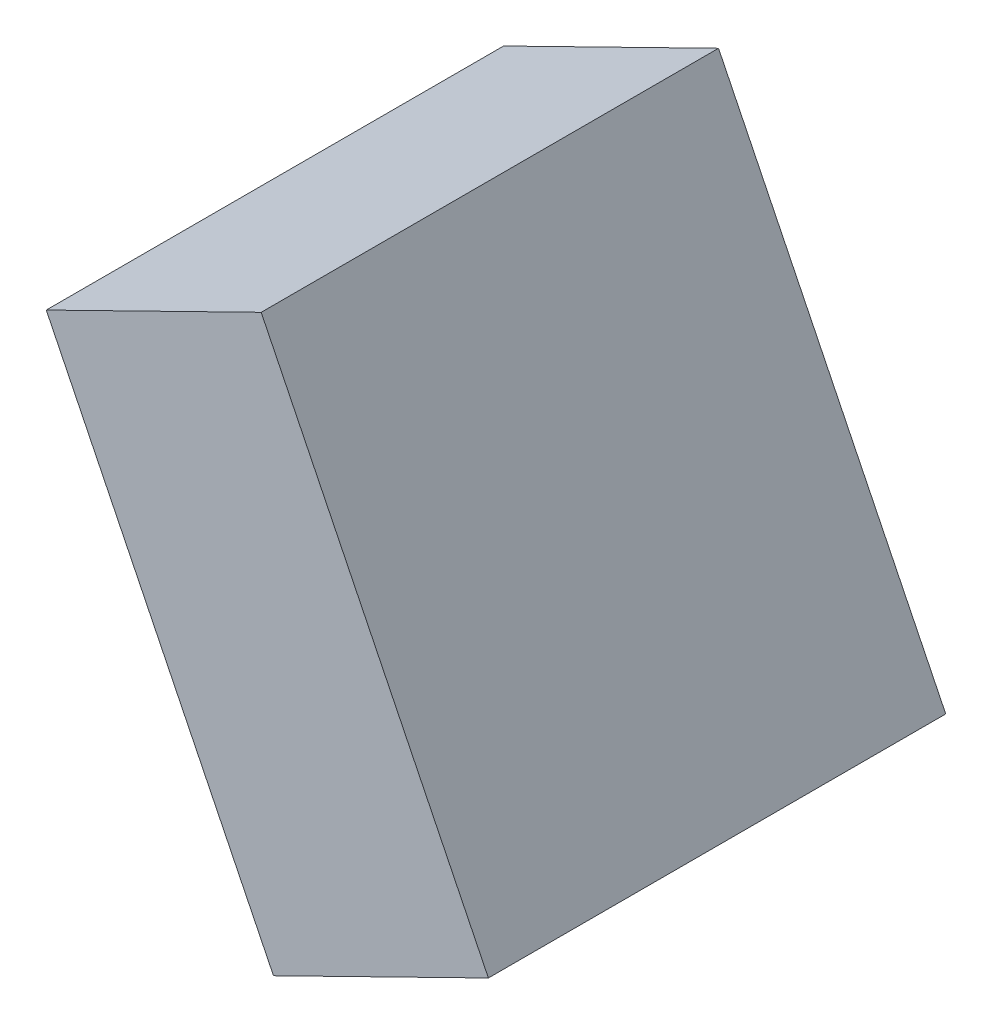
ISO-10303-21;
HEADER;
FILE_DESCRIPTION(('STEP AP214'),'2;1');
FILE_NAME('part.step','',(''),(''),'','','');
FILE_SCHEMA(('AUTOMOTIVE_DESIGN { 1 0 10303 214 1 1 1 1 }'));
ENDSEC;
DATA;
#1=APPLICATION_CONTEXT('core data for automotive mechanical design processes');
#2=APPLICATION_PROTOCOL_DEFINITION('international standard','automotive_design',2000,#1);
#3=PRODUCT_CONTEXT('',#1,'mechanical');
#4=PRODUCT('Part','Part','',(#3));
#5=PRODUCT_RELATED_PRODUCT_CATEGORY('part','',(#4));
#6=PRODUCT_DEFINITION_FORMATION('','',#4);
#7=PRODUCT_DEFINITION_CONTEXT('part definition',#1,'design');
#8=PRODUCT_DEFINITION('design','',#6,#7);
#9=PRODUCT_DEFINITION_SHAPE('','',#8);
#10=(LENGTH_UNIT() NAMED_UNIT(*) SI_UNIT(.MILLI.,.METRE.));
#11=(NAMED_UNIT(*) PLANE_ANGLE_UNIT() SI_UNIT($,.RADIAN.));
#12=(NAMED_UNIT(*) SI_UNIT($,.STERADIAN.) SOLID_ANGLE_UNIT());
#13=UNCERTAINTY_MEASURE_WITH_UNIT(LENGTH_MEASURE(1.E-05),#10,'distance_accuracy_value','');
#14=(GEOMETRIC_REPRESENTATION_CONTEXT(3) GLOBAL_UNCERTAINTY_ASSIGNED_CONTEXT((#13)) GLOBAL_UNIT_ASSIGNED_CONTEXT((#10,
#11,#12)) REPRESENTATION_CONTEXT('',''));
#15=CARTESIAN_POINT('',(0.,0.,0.));
#16=DIRECTION('',(0.,0.,1.));
#17=DIRECTION('',(1.,0.,0.));
#18=AXIS2_PLACEMENT_3D('',#15,#16,#17);
#19=CARTESIAN_POINT('',(16.9701833283078,3.96287025484047,1.));
#20=DIRECTION('',(0.,0.,1.));
#21=DIRECTION('',(1.,0.,0.));
#22=AXIS2_PLACEMENT_3D('',#19,#20,#21);
#23=PLANE('',#22);
#24=DIRECTION('',(0.897693183646139,0.440621093497872,0.));
#25=VECTOR('',#24,1.);
#26=CARTESIAN_POINT('',(30.3329714186362,19.6346779445206,1.));
#27=LINE('',#26,#25);
#28=CARTESIAN_POINT('',(26.8319680024163,17.9162556798789,1.));
#29=VERTEX_POINT('',#28);
#30=CARTESIAN_POINT('',(33.8339748348562,21.3531002091622,1.));
#31=VERTEX_POINT('',#30);
#32=EDGE_CURVE('E116',#29,#31,#27,.T.);
#33=ORIENTED_EDGE('',*,*,#32,.T.);
#34=DIRECTION('',(0.440621093497872,-0.897693183646139,0.));
#35=VECTOR('',#34,1.);
#36=CARTESIAN_POINT('',(37.5351920202383,13.8124774665347,1.));
#37=LINE('',#36,#35);
#38=CARTESIAN_POINT('',(41.2364092056204,6.27185472390714,1.));
#39=VERTEX_POINT('',#38);
#40=EDGE_CURVE('E25',#31,#39,#37,.T.);
#41=ORIENTED_EDGE('',*,*,#40,.T.);
#42=DIRECTION('',(0.897693183646139,0.440621093497872,0.));
#43=VECTOR('',#42,1.);
#44=CARTESIAN_POINT('',(37.7354057894005,4.55343245926544,1.));
#45=LINE('',#44,#43);
#46=CARTESIAN_POINT('',(34.2344023731805,2.83501019462374,1.));
#47=VERTEX_POINT('',#46);
#48=EDGE_CURVE('E66',#47,#39,#45,.T.);
#49=ORIENTED_EDGE('',*,*,#48,.F.);
#50=DIRECTION('',(0.440621093497872,-0.897693183646139,0.));
#51=VECTOR('',#50,1.);
#52=CARTESIAN_POINT('',(30.5331851877983,10.3756329372513,1.));
#53=LINE('',#52,#51);
#54=EDGE_CURVE('E69',#29,#47,#53,.T.);
#55=ORIENTED_EDGE('',*,*,#54,.F.);
#56=EDGE_LOOP('',(#33,#41,#49,#55));
#57=FACE_BOUND('',#56,.T.);
#58=ADVANCED_FACE('F17',(#57),#23,.F.);
#59=CARTESIAN_POINT('',(16.9701833283078,3.96287025484047,15.9));
#60=DIRECTION('',(0.,0.,1.));
#61=DIRECTION('',(1.,0.,0.));
#62=AXIS2_PLACEMENT_3D('',#59,#60,#61);
#63=PLANE('',#62);
#64=DIRECTION('',(0.897693183646139,0.440621093497872,0.));
#65=VECTOR('',#64,1.);
#66=CARTESIAN_POINT('',(30.3329714186362,19.6346779445206,15.9));
#67=LINE('',#66,#65);
#68=CARTESIAN_POINT('',(26.8319680024163,17.9162556798789,15.9));
#69=VERTEX_POINT('',#68);
#70=CARTESIAN_POINT('',(33.8339748348562,21.3531002091622,15.9));
#71=VERTEX_POINT('',#70);
#72=EDGE_CURVE('E97',#69,#71,#67,.T.);
#73=ORIENTED_EDGE('',*,*,#72,.F.);
#74=DIRECTION('',(0.440621093497872,-0.897693183646139,0.));
#75=VECTOR('',#74,1.);
#76=CARTESIAN_POINT('',(30.5331851877983,10.3756329372513,15.9));
#77=LINE('',#76,#75);
#78=CARTESIAN_POINT('',(34.2344023731805,2.83501019462374,15.9));
#79=VERTEX_POINT('',#78);
#80=EDGE_CURVE('E75',#69,#79,#77,.T.);
#81=ORIENTED_EDGE('',*,*,#80,.T.);
#82=DIRECTION('',(0.897693183646139,0.440621093497872,0.));
#83=VECTOR('',#82,1.);
#84=CARTESIAN_POINT('',(37.7354057894005,4.55343245926544,15.9));
#85=LINE('',#84,#83);
#86=CARTESIAN_POINT('',(41.2364092056204,6.27185472390714,15.9));
#87=VERTEX_POINT('',#86);
#88=EDGE_CURVE('E80',#79,#87,#85,.T.);
#89=ORIENTED_EDGE('',*,*,#88,.T.);
#90=DIRECTION('',(0.440621093497872,-0.897693183646139,0.));
#91=VECTOR('',#90,1.);
#92=CARTESIAN_POINT('',(37.5351920202383,13.8124774665347,15.9));
#93=LINE('',#92,#91);
#94=EDGE_CURVE('E11',#71,#87,#93,.T.);
#95=ORIENTED_EDGE('',*,*,#94,.F.);
#96=EDGE_LOOP('',(#73,#81,#89,#95));
#97=FACE_BOUND('',#96,.T.);
#98=ADVANCED_FACE('F111',(#97),#63,.T.);
#99=CARTESIAN_POINT('',(37.5351920202383,13.8124774665347,15.9));
#100=DIRECTION('',(0.897693183646138,0.440621093497872,0.));
#101=DIRECTION('',(0.,0.,-1.));
#102=AXIS2_PLACEMENT_3D('',#99,#100,#101);
#103=PLANE('',#102);
#104=ORIENTED_EDGE('',*,*,#40,.F.);
#105=DIRECTION('',(0.,0.,-1.));
#106=VECTOR('',#105,1.);
#107=CARTESIAN_POINT('',(33.8339748348562,21.3531002091622,15.9));
#108=LINE('',#107,#106);
#109=EDGE_CURVE('E90',#71,#31,#108,.T.);
#110=ORIENTED_EDGE('',*,*,#109,.F.);
#111=ORIENTED_EDGE('',*,*,#94,.T.);
#112=DIRECTION('',(0.,0.,-1.));
#113=VECTOR('',#112,1.);
#114=CARTESIAN_POINT('',(41.2364092056204,6.27185472390714,15.9));
#115=LINE('',#114,#113);
#116=EDGE_CURVE('E74',#87,#39,#115,.T.);
#117=ORIENTED_EDGE('',*,*,#116,.T.);
#118=EDGE_LOOP('',(#104,#110,#111,#117));
#119=FACE_BOUND('',#118,.T.);
#120=ADVANCED_FACE('F112',(#119),#103,.T.);
#121=CARTESIAN_POINT('',(37.7354057894005,4.55343245926544,15.9));
#122=DIRECTION('',(-0.440621093497872,0.897693183646139,0.));
#123=DIRECTION('',(0.,0.,1.));
#124=AXIS2_PLACEMENT_3D('',#121,#122,#123);
#125=PLANE('',#124);
#126=ORIENTED_EDGE('',*,*,#48,.T.);
#127=ORIENTED_EDGE('',*,*,#116,.F.);
#128=ORIENTED_EDGE('',*,*,#88,.F.);
#129=DIRECTION('',(0.,0.,-1.));
#130=VECTOR('',#129,1.);
#131=CARTESIAN_POINT('',(34.2344023731805,2.83501019462374,15.9));
#132=LINE('',#131,#130);
#133=EDGE_CURVE('E78',#79,#47,#132,.T.);
#134=ORIENTED_EDGE('',*,*,#133,.T.);
#135=EDGE_LOOP('',(#126,#127,#128,#134));
#136=FACE_BOUND('',#135,.T.);
#137=ADVANCED_FACE('F79',(#136),#125,.F.);
#138=CARTESIAN_POINT('',(30.5331851877983,10.3756329372513,15.9));
#139=DIRECTION('',(0.897693183646139,0.440621093497872,0.));
#140=DIRECTION('',(0.,0.,-1.));
#141=AXIS2_PLACEMENT_3D('',#138,#139,#140);
#142=PLANE('',#141);
#143=ORIENTED_EDGE('',*,*,#54,.T.);
#144=ORIENTED_EDGE('',*,*,#133,.F.);
#145=ORIENTED_EDGE('',*,*,#80,.F.);
#146=DIRECTION('',(0.,0.,-1.));
#147=VECTOR('',#146,1.);
#148=CARTESIAN_POINT('',(26.8319680024163,17.9162556798789,15.9));
#149=LINE('',#148,#147);
#150=EDGE_CURVE('E87',#69,#29,#149,.T.);
#151=ORIENTED_EDGE('',*,*,#150,.T.);
#152=EDGE_LOOP('',(#143,#144,#145,#151));
#153=FACE_BOUND('',#152,.T.);
#154=ADVANCED_FACE('F85',(#153),#142,.F.);
#155=CARTESIAN_POINT('',(30.3329714186362,19.6346779445206,15.9));
#156=DIRECTION('',(-0.440621093497872,0.897693183646139,0.));
#157=DIRECTION('',(0.,0.,1.));
#158=AXIS2_PLACEMENT_3D('',#155,#156,#157);
#159=PLANE('',#158);
#160=ORIENTED_EDGE('',*,*,#32,.F.);
#161=ORIENTED_EDGE('',*,*,#150,.F.);
#162=ORIENTED_EDGE('',*,*,#72,.T.);
#163=ORIENTED_EDGE('',*,*,#109,.T.);
#164=EDGE_LOOP('',(#160,#161,#162,#163));
#165=FACE_BOUND('',#164,.T.);
#166=ADVANCED_FACE('F115',(#165),#159,.T.);
#167=CLOSED_SHELL('',(#58,#98,#120,#137,#154,#166));
#168=MANIFOLD_SOLID_BREP('B1',#167);
#169=ADVANCED_BREP_SHAPE_REPRESENTATION('',(#18,#168),#14);
#170=SHAPE_DEFINITION_REPRESENTATION(#9,#169);
ENDSEC;
END-ISO-10303-21;
